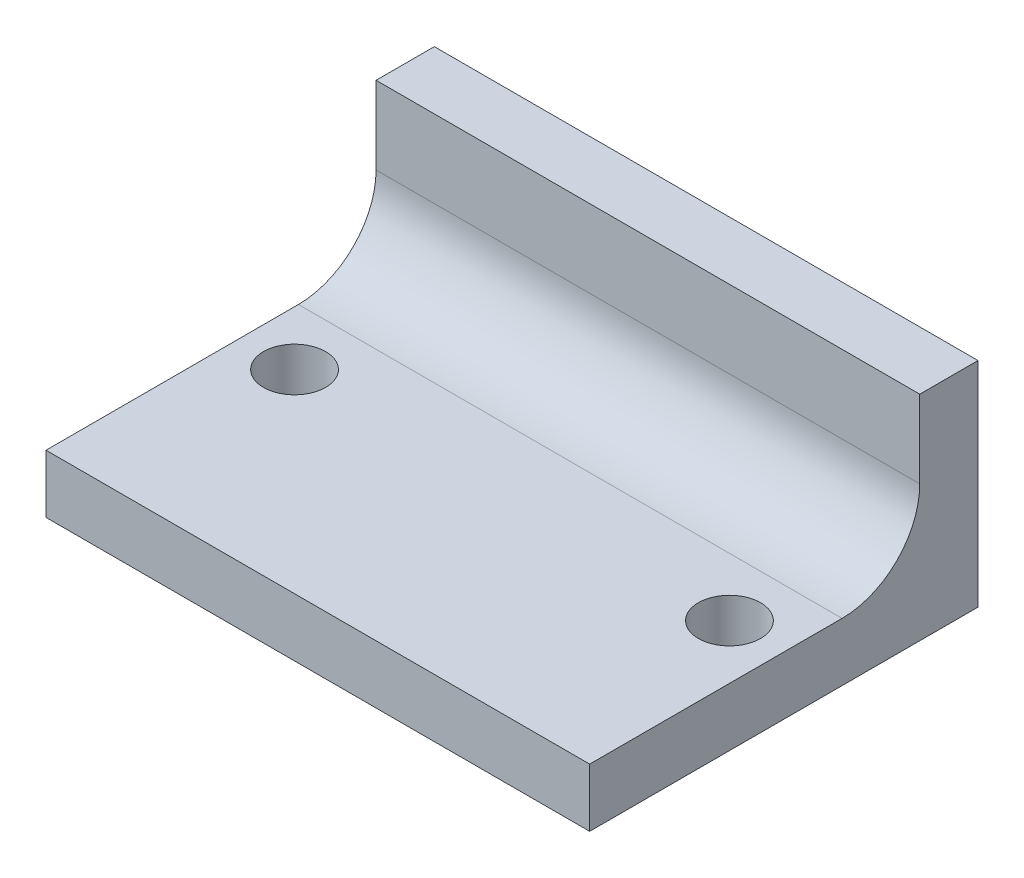
ISO-10303-21;
HEADER;
FILE_DESCRIPTION(('STEP AP214'),'2;1');
FILE_NAME('part.step','',(''),(''),'','','');
FILE_SCHEMA(('AUTOMOTIVE_DESIGN { 1 0 10303 214 1 1 1 1 }'));
ENDSEC;
DATA;
#1=APPLICATION_CONTEXT('core data for automotive mechanical design processes');
#2=APPLICATION_PROTOCOL_DEFINITION('international standard','automotive_design',2000,#1);
#3=PRODUCT_CONTEXT('',#1,'mechanical');
#4=PRODUCT('Part','Part','',(#3));
#5=PRODUCT_RELATED_PRODUCT_CATEGORY('part','',(#4));
#6=PRODUCT_DEFINITION_FORMATION('','',#4);
#7=PRODUCT_DEFINITION_CONTEXT('part definition',#1,'design');
#8=PRODUCT_DEFINITION('design','',#6,#7);
#9=PRODUCT_DEFINITION_SHAPE('','',#8);
#10=(LENGTH_UNIT() NAMED_UNIT(*) SI_UNIT(.MILLI.,.METRE.));
#11=(NAMED_UNIT(*) PLANE_ANGLE_UNIT() SI_UNIT($,.RADIAN.));
#12=(NAMED_UNIT(*) SI_UNIT($,.STERADIAN.) SOLID_ANGLE_UNIT());
#13=UNCERTAINTY_MEASURE_WITH_UNIT(LENGTH_MEASURE(1.E-05),#10,'distance_accuracy_value','');
#14=(GEOMETRIC_REPRESENTATION_CONTEXT(3) GLOBAL_UNCERTAINTY_ASSIGNED_CONTEXT((#13)) GLOBAL_UNIT_ASSIGNED_CONTEXT((#10,
#11,#12)) REPRESENTATION_CONTEXT('',''));
#15=CARTESIAN_POINT('',(0.,0.,0.));
#16=DIRECTION('',(0.,0.,1.));
#17=DIRECTION('',(1.,0.,0.));
#18=AXIS2_PLACEMENT_3D('',#15,#16,#17);
#19=CARTESIAN_POINT('',(-30.5309481613078,17.5,-7.57106067562949));
#20=DIRECTION('',(1.,0.,0.));
#21=DIRECTION('',(0.,0.,-1.));
#22=AXIS2_PLACEMENT_3D('',#19,#20,#21);
#23=CYLINDRICAL_SURFACE('',#22,10.);
#24=DIRECTION('',(1.,0.,0.));
#25=VECTOR('',#24,1.);
#26=CARTESIAN_POINT('',(-30.5309481613078,17.5,-17.5710606756295));
#27=LINE('',#26,#25);
#28=CARTESIAN_POINT('',(-30.5309481613078,17.5,-17.5710606756295));
#29=VERTEX_POINT('',#28);
#30=CARTESIAN_POINT('',(39.4690518386923,17.5,-17.5710606756295));
#31=VERTEX_POINT('',#30);
#32=EDGE_CURVE('E187',#29,#31,#27,.T.);
#33=ORIENTED_EDGE('',*,*,#32,.F.);
#34=CARTESIAN_POINT('',(-30.5309481613078,17.5,-7.57106067562949));
#35=DIRECTION('',(1.,0.,0.));
#36=DIRECTION('',(0.,0.,-1.));
#37=AXIS2_PLACEMENT_3D('',#34,#35,#36);
#38=CIRCLE('',#37,10.);
#39=CARTESIAN_POINT('',(-30.5309481613078,7.5,-7.57106067562949));
#40=VERTEX_POINT('',#39);
#41=EDGE_CURVE('E53',#29,#40,#38,.F.);
#42=ORIENTED_EDGE('',*,*,#41,.T.);
#43=DIRECTION('',(1.,0.,0.));
#44=VECTOR('',#43,1.);
#45=CARTESIAN_POINT('',(0.,7.5,-7.57106067562949));
#46=LINE('',#45,#44);
#47=CARTESIAN_POINT('',(39.4690518386923,7.5,-7.57106067562949));
#48=VERTEX_POINT('',#47);
#49=EDGE_CURVE('E190',#48,#40,#46,.F.);
#50=ORIENTED_EDGE('',*,*,#49,.F.);
#51=CARTESIAN_POINT('',(39.4690518386923,17.5,-7.57106067562949));
#52=DIRECTION('',(-1.,0.,0.));
#53=DIRECTION('',(0.,0.,1.));
#54=AXIS2_PLACEMENT_3D('',#51,#52,#53);
#55=CIRCLE('',#54,10.);
#56=EDGE_CURVE('E11',#48,#31,#55,.F.);
#57=ORIENTED_EDGE('',*,*,#56,.T.);
#58=EDGE_LOOP('',(#33,#42,#50,#57));
#59=FACE_BOUND('',#58,.T.);
#60=ADVANCED_FACE('F45',(#59),#23,.F.);
#61=CARTESIAN_POINT('',(0.,7.5,0.));
#62=DIRECTION('',(0.,1.,0.));
#63=DIRECTION('',(0.,0.,1.));
#64=AXIS2_PLACEMENT_3D('',#61,#62,#63);
#65=PLANE('',#64);
#66=DIRECTION('',(0.,0.,-1.));
#67=VECTOR('',#66,1.);
#68=CARTESIAN_POINT('',(39.4690518386923,7.5,-25.0710606756295));
#69=LINE('',#68,#67);
#70=CARTESIAN_POINT('',(39.4690518386923,7.5,24.9289393243705));
#71=VERTEX_POINT('',#70);
#72=EDGE_CURVE('E158',#71,#48,#69,.T.);
#73=ORIENTED_EDGE('',*,*,#72,.T.);
#74=ORIENTED_EDGE('',*,*,#49,.T.);
#75=DIRECTION('',(0.,0.,1.));
#76=VECTOR('',#75,1.);
#77=CARTESIAN_POINT('',(-30.5309481613078,7.5,-25.0710606756295));
#78=LINE('',#77,#76);
#79=CARTESIAN_POINT('',(-30.5309481613077,7.5,24.9289393243705));
#80=VERTEX_POINT('',#79);
#81=EDGE_CURVE('E151',#40,#80,#78,.T.);
#82=ORIENTED_EDGE('',*,*,#81,.T.);
#83=DIRECTION('',(1.,0.,0.));
#84=VECTOR('',#83,1.);
#85=CARTESIAN_POINT('',(-30.5309481613077,7.5,24.9289393243705));
#86=LINE('',#85,#84);
#87=EDGE_CURVE('E154',#80,#71,#86,.T.);
#88=ORIENTED_EDGE('',*,*,#87,.T.);
#89=EDGE_LOOP('',(#73,#74,#82,#88));
#90=FACE_BOUND('',#89,.T.);
#91=CARTESIAN_POINT('',(32.4690518386923,7.5,-0.0710606756294876));
#92=DIRECTION('',(0.,1.,0.));
#93=DIRECTION('',(0.,0.,1.));
#94=AXIS2_PLACEMENT_3D('',#91,#92,#93);
#95=CIRCLE('',#94,4.00000000000001);
#96=CARTESIAN_POINT('',(32.4690518386923,7.5,3.92893932437052));
#97=VERTEX_POINT('',#96);
#98=EDGE_CURVE('E143',#97,#97,#95,.T.);
#99=ORIENTED_EDGE('',*,*,#98,.F.);
#100=EDGE_LOOP('',(#99));
#101=FACE_BOUND('',#100,.T.);
#102=CARTESIAN_POINT('',(-23.5309481613077,7.5,-0.0710606756294807));
#103=DIRECTION('',(0.,1.,0.));
#104=DIRECTION('',(0.,0.,-1.));
#105=AXIS2_PLACEMENT_3D('',#102,#103,#104);
#106=CIRCLE('',#105,4.00000000000001);
#107=CARTESIAN_POINT('',(-23.5309481613077,7.5,-4.07106067562949));
#108=VERTEX_POINT('',#107);
#109=EDGE_CURVE('E134',#108,#108,#106,.T.);
#110=ORIENTED_EDGE('',*,*,#109,.F.);
#111=EDGE_LOOP('',(#110));
#112=FACE_BOUND('',#111,.T.);
#113=ADVANCED_FACE('F194',(#90,#101,#112),#65,.T.);
#114=CARTESIAN_POINT('',(0.,0.,0.));
#115=DIRECTION('',(0.,1.,0.));
#116=DIRECTION('',(0.,0.,1.));
#117=AXIS2_PLACEMENT_3D('',#114,#115,#116);
#118=PLANE('',#117);
#119=DIRECTION('',(0.,0.,1.));
#120=VECTOR('',#119,1.);
#121=CARTESIAN_POINT('',(-30.5309481613078,0.,-25.0710606756295));
#122=LINE('',#121,#120);
#123=CARTESIAN_POINT('',(-30.5309481613078,0.,-25.0710606756295));
#124=VERTEX_POINT('',#123);
#125=CARTESIAN_POINT('',(-30.5309481613077,0.,24.9289393243705));
#126=VERTEX_POINT('',#125);
#127=EDGE_CURVE('E147',#124,#126,#122,.T.);
#128=ORIENTED_EDGE('',*,*,#127,.F.);
#129=DIRECTION('',(-1.,0.,0.));
#130=VECTOR('',#129,1.);
#131=CARTESIAN_POINT('',(-30.5309481613078,0.,-25.0710606756295));
#132=LINE('',#131,#130);
#133=CARTESIAN_POINT('',(39.4690518386923,0.,-25.0710606756295));
#134=VERTEX_POINT('',#133);
#135=EDGE_CURVE('E155',#134,#124,#132,.T.);
#136=ORIENTED_EDGE('',*,*,#135,.F.);
#137=DIRECTION('',(0.,0.,-1.));
#138=VECTOR('',#137,1.);
#139=CARTESIAN_POINT('',(39.4690518386923,0.,-25.0710606756295));
#140=LINE('',#139,#138);
#141=CARTESIAN_POINT('',(39.4690518386923,0.,24.9289393243705));
#142=VERTEX_POINT('',#141);
#143=EDGE_CURVE('E168',#142,#134,#140,.T.);
#144=ORIENTED_EDGE('',*,*,#143,.F.);
#145=DIRECTION('',(1.,0.,0.));
#146=VECTOR('',#145,1.);
#147=CARTESIAN_POINT('',(-30.5309481613077,0.,24.9289393243705));
#148=LINE('',#147,#146);
#149=EDGE_CURVE('E165',#126,#142,#148,.T.);
#150=ORIENTED_EDGE('',*,*,#149,.F.);
#151=EDGE_LOOP('',(#128,#136,#144,#150));
#152=FACE_BOUND('',#151,.T.);
#153=CARTESIAN_POINT('',(32.4690518386923,0.,-0.0710606756294876));
#154=DIRECTION('',(0.,1.,0.));
#155=DIRECTION('',(0.,0.,1.));
#156=AXIS2_PLACEMENT_3D('',#153,#154,#155);
#157=CIRCLE('',#156,4.00000000000001);
#158=CARTESIAN_POINT('',(32.4690518386923,0.,3.92893932437052));
#159=VERTEX_POINT('',#158);
#160=EDGE_CURVE('E141',#159,#159,#157,.T.);
#161=ORIENTED_EDGE('',*,*,#160,.T.);
#162=EDGE_LOOP('',(#161));
#163=FACE_BOUND('',#162,.T.);
#164=CARTESIAN_POINT('',(-23.5309481613077,0.,-0.0710606756294807));
#165=DIRECTION('',(0.,1.,0.));
#166=DIRECTION('',(0.,0.,-1.));
#167=AXIS2_PLACEMENT_3D('',#164,#165,#166);
#168=CIRCLE('',#167,4.00000000000001);
#169=CARTESIAN_POINT('',(-23.5309481613077,0.,-4.07106067562949));
#170=VERTEX_POINT('',#169);
#171=EDGE_CURVE('E129',#170,#170,#168,.T.);
#172=ORIENTED_EDGE('',*,*,#171,.T.);
#173=EDGE_LOOP('',(#172));
#174=FACE_BOUND('',#173,.T.);
#175=ADVANCED_FACE('F222',(#152,#163,#174),#118,.F.);
#176=CARTESIAN_POINT('',(-30.5309481613078,7.5,-25.0710606756295));
#177=DIRECTION('',(1.,0.,0.));
#178=DIRECTION('',(0.,0.,-1.));
#179=AXIS2_PLACEMENT_3D('',#176,#177,#178);
#180=PLANE('',#179);
#181=ORIENTED_EDGE('',*,*,#127,.T.);
#182=DIRECTION('',(0.,-1.,0.));
#183=VECTOR('',#182,1.);
#184=CARTESIAN_POINT('',(-30.5309481613077,7.5,24.9289393243705));
#185=LINE('',#184,#183);
#186=EDGE_CURVE('E183',#80,#126,#185,.T.);
#187=ORIENTED_EDGE('',*,*,#186,.F.);
#188=ORIENTED_EDGE('',*,*,#81,.F.);
#189=ORIENTED_EDGE('',*,*,#41,.F.);
#190=DIRECTION('',(0.,-1.,0.));
#191=VECTOR('',#190,1.);
#192=CARTESIAN_POINT('',(-30.5309481613078,27.5,-17.5710606756295));
#193=LINE('',#192,#191);
#194=CARTESIAN_POINT('',(-30.5309481613078,27.5,-17.5710606756295));
#195=VERTEX_POINT('',#194);
#196=EDGE_CURVE('E107',#195,#29,#193,.T.);
#197=ORIENTED_EDGE('',*,*,#196,.F.);
#198=DIRECTION('',(0.,0.,1.));
#199=VECTOR('',#198,1.);
#200=CARTESIAN_POINT('',(-30.5309481613078,27.5,-25.0710606756295));
#201=LINE('',#200,#199);
#202=CARTESIAN_POINT('',(-30.5309481613078,27.5,-25.0710606756295));
#203=VERTEX_POINT('',#202);
#204=EDGE_CURVE('E114',#203,#195,#201,.T.);
#205=ORIENTED_EDGE('',*,*,#204,.F.);
#206=DIRECTION('',(0.,-1.,0.));
#207=VECTOR('',#206,1.);
#208=CARTESIAN_POINT('',(-30.5309481613078,7.5,-25.0710606756295));
#209=LINE('',#208,#207);
#210=EDGE_CURVE('E162',#203,#124,#209,.T.);
#211=ORIENTED_EDGE('',*,*,#210,.T.);
#212=EDGE_LOOP('',(#181,#187,#188,#189,#197,#205,#211));
#213=FACE_BOUND('',#212,.T.);
#214=ADVANCED_FACE('F126',(#213),#180,.F.);
#215=CARTESIAN_POINT('',(-30.5309481613077,7.5,24.9289393243705));
#216=DIRECTION('',(0.,0.,-1.));
#217=DIRECTION('',(-1.,0.,0.));
#218=AXIS2_PLACEMENT_3D('',#215,#216,#217);
#219=PLANE('',#218);
#220=ORIENTED_EDGE('',*,*,#149,.T.);
#221=DIRECTION('',(0.,-1.,0.));
#222=VECTOR('',#221,1.);
#223=CARTESIAN_POINT('',(39.4690518386923,7.5,24.9289393243705));
#224=LINE('',#223,#222);
#225=EDGE_CURVE('E179',#71,#142,#224,.T.);
#226=ORIENTED_EDGE('',*,*,#225,.F.);
#227=ORIENTED_EDGE('',*,*,#87,.F.);
#228=ORIENTED_EDGE('',*,*,#186,.T.);
#229=EDGE_LOOP('',(#220,#226,#227,#228));
#230=FACE_BOUND('',#229,.T.);
#231=ADVANCED_FACE('F200',(#230),#219,.F.);
#232=CARTESIAN_POINT('',(39.4690518386923,7.5,-25.0710606756295));
#233=DIRECTION('',(-1.,0.,0.));
#234=DIRECTION('',(0.,0.,1.));
#235=AXIS2_PLACEMENT_3D('',#232,#233,#234);
#236=PLANE('',#235);
#237=ORIENTED_EDGE('',*,*,#143,.T.);
#238=DIRECTION('',(0.,-1.,0.));
#239=VECTOR('',#238,1.);
#240=CARTESIAN_POINT('',(39.4690518386923,7.5,-25.0710606756295));
#241=LINE('',#240,#239);
#242=CARTESIAN_POINT('',(39.4690518386923,27.5,-25.0710606756295));
#243=VERTEX_POINT('',#242);
#244=EDGE_CURVE('E175',#243,#134,#241,.T.);
#245=ORIENTED_EDGE('',*,*,#244,.F.);
#246=DIRECTION('',(0.,0.,-1.));
#247=VECTOR('',#246,1.);
#248=CARTESIAN_POINT('',(39.4690518386923,27.5,-25.0710606756295));
#249=LINE('',#248,#247);
#250=CARTESIAN_POINT('',(39.4690518386923,27.5,-17.5710606756295));
#251=VERTEX_POINT('',#250);
#252=EDGE_CURVE('E113',#251,#243,#249,.T.);
#253=ORIENTED_EDGE('',*,*,#252,.F.);
#254=DIRECTION('',(0.,-1.,0.));
#255=VECTOR('',#254,1.);
#256=CARTESIAN_POINT('',(39.4690518386923,27.5,-17.5710606756295));
#257=LINE('',#256,#255);
#258=EDGE_CURVE('E108',#251,#31,#257,.T.);
#259=ORIENTED_EDGE('',*,*,#258,.T.);
#260=ORIENTED_EDGE('',*,*,#56,.F.);
#261=ORIENTED_EDGE('',*,*,#72,.F.);
#262=ORIENTED_EDGE('',*,*,#225,.T.);
#263=EDGE_LOOP('',(#237,#245,#253,#259,#260,#261,#262));
#264=FACE_BOUND('',#263,.T.);
#265=ADVANCED_FACE('F203',(#264),#236,.F.);
#266=CARTESIAN_POINT('',(-30.5309481613078,7.5,-25.0710606756295));
#267=DIRECTION('',(0.,0.,1.));
#268=DIRECTION('',(1.,0.,0.));
#269=AXIS2_PLACEMENT_3D('',#266,#267,#268);
#270=PLANE('',#269);
#271=ORIENTED_EDGE('',*,*,#135,.T.);
#272=ORIENTED_EDGE('',*,*,#210,.F.);
#273=DIRECTION('',(-1.,0.,0.));
#274=VECTOR('',#273,1.);
#275=CARTESIAN_POINT('',(-30.5309481613078,27.5,-25.0710606756295));
#276=LINE('',#275,#274);
#277=EDGE_CURVE('E120',#243,#203,#276,.T.);
#278=ORIENTED_EDGE('',*,*,#277,.F.);
#279=ORIENTED_EDGE('',*,*,#244,.T.);
#280=EDGE_LOOP('',(#271,#272,#278,#279));
#281=FACE_BOUND('',#280,.T.);
#282=ADVANCED_FACE('F205',(#281),#270,.F.);
#283=CARTESIAN_POINT('',(32.4690518386923,7.5,-0.0710606756294876));
#284=DIRECTION('',(0.,-1.,0.));
#285=DIRECTION('',(0.,0.,-1.));
#286=AXIS2_PLACEMENT_3D('',#283,#284,#285);
#287=CYLINDRICAL_SURFACE('',#286,4.00000000000001);
#288=ORIENTED_EDGE('',*,*,#98,.T.);
#289=EDGE_LOOP('',(#288));
#290=FACE_BOUND('',#289,.T.);
#291=ORIENTED_EDGE('',*,*,#160,.F.);
#292=EDGE_LOOP('',(#291));
#293=FACE_BOUND('',#292,.T.);
#294=ADVANCED_FACE('F212',(#290,#293),#287,.F.);
#295=CARTESIAN_POINT('',(-23.5309481613077,7.5,-0.0710606756294807));
#296=DIRECTION('',(0.,-1.,0.));
#297=DIRECTION('',(0.,0.,-1.));
#298=AXIS2_PLACEMENT_3D('',#295,#296,#297);
#299=CYLINDRICAL_SURFACE('',#298,4.00000000000001);
#300=ORIENTED_EDGE('',*,*,#109,.T.);
#301=EDGE_LOOP('',(#300));
#302=FACE_BOUND('',#301,.T.);
#303=ORIENTED_EDGE('',*,*,#171,.F.);
#304=EDGE_LOOP('',(#303));
#305=FACE_BOUND('',#304,.T.);
#306=ADVANCED_FACE('F236',(#302,#305),#299,.F.);
#307=CARTESIAN_POINT('',(-30.5309481613078,27.5,-17.5710606756295));
#308=DIRECTION('',(0.,0.,-1.));
#309=DIRECTION('',(-1.,0.,0.));
#310=AXIS2_PLACEMENT_3D('',#307,#308,#309);
#311=PLANE('',#310);
#312=ORIENTED_EDGE('',*,*,#196,.T.);
#313=ORIENTED_EDGE('',*,*,#32,.T.);
#314=ORIENTED_EDGE('',*,*,#258,.F.);
#315=DIRECTION('',(1.,0.,0.));
#316=VECTOR('',#315,1.);
#317=CARTESIAN_POINT('',(-30.5309481613078,27.5,-17.5710606756295));
#318=LINE('',#317,#316);
#319=EDGE_CURVE('E102',#195,#251,#318,.T.);
#320=ORIENTED_EDGE('',*,*,#319,.F.);
#321=EDGE_LOOP('',(#312,#313,#314,#320));
#322=FACE_BOUND('',#321,.T.);
#323=ADVANCED_FACE('F104',(#322),#311,.F.);
#324=CARTESIAN_POINT('',(0.,27.5,0.));
#325=DIRECTION('',(0.,1.,0.));
#326=DIRECTION('',(0.,0.,1.));
#327=AXIS2_PLACEMENT_3D('',#324,#325,#326);
#328=PLANE('',#327);
#329=ORIENTED_EDGE('',*,*,#204,.T.);
#330=ORIENTED_EDGE('',*,*,#319,.T.);
#331=ORIENTED_EDGE('',*,*,#252,.T.);
#332=ORIENTED_EDGE('',*,*,#277,.T.);
#333=EDGE_LOOP('',(#329,#330,#331,#332));
#334=FACE_BOUND('',#333,.T.);
#335=ADVANCED_FACE('F118',(#334),#328,.T.);
#336=CLOSED_SHELL('',(#60,#113,#175,#214,#231,#265,#282,#294,#306,#323,#335));
#337=MANIFOLD_SOLID_BREP('B2',#336);
#338=ADVANCED_BREP_SHAPE_REPRESENTATION('',(#18,#337),#14);
#339=SHAPE_DEFINITION_REPRESENTATION(#9,#338);
ENDSEC;
END-ISO-10303-21;
